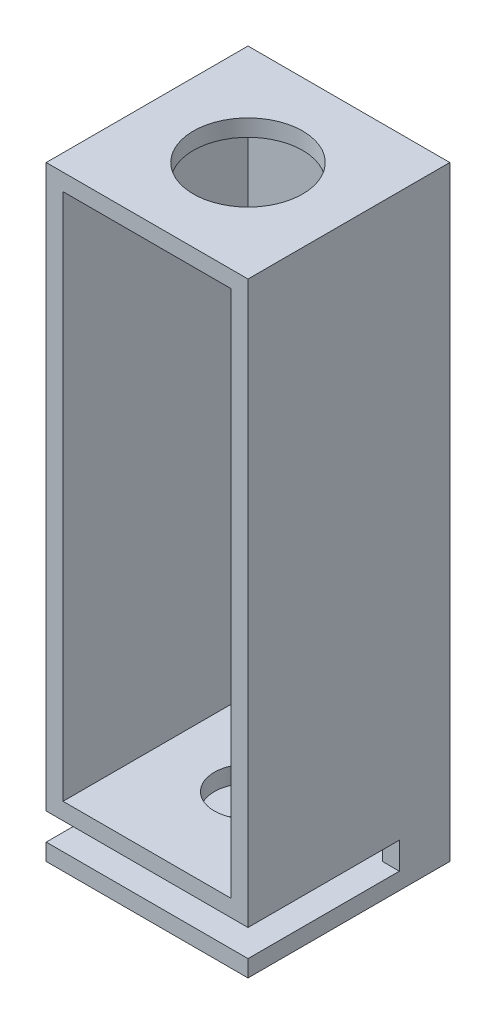
ISO-10303-21;
HEADER;
FILE_DESCRIPTION(('STEP AP214'),'2;1');
FILE_NAME('part.step','',(''),(''),'','','');
FILE_SCHEMA(('AUTOMOTIVE_DESIGN { 1 0 10303 214 1 1 1 1 }'));
ENDSEC;
DATA;
#1=APPLICATION_CONTEXT('core data for automotive mechanical design processes');
#2=APPLICATION_PROTOCOL_DEFINITION('international standard','automotive_design',2000,#1);
#3=PRODUCT_CONTEXT('',#1,'mechanical');
#4=PRODUCT('Part','Part','',(#3));
#5=PRODUCT_RELATED_PRODUCT_CATEGORY('part','',(#4));
#6=PRODUCT_DEFINITION_FORMATION('','',#4);
#7=PRODUCT_DEFINITION_CONTEXT('part definition',#1,'design');
#8=PRODUCT_DEFINITION('design','',#6,#7);
#9=PRODUCT_DEFINITION_SHAPE('','',#8);
#10=(LENGTH_UNIT() NAMED_UNIT(*) SI_UNIT(.MILLI.,.METRE.));
#11=(NAMED_UNIT(*) PLANE_ANGLE_UNIT() SI_UNIT($,.RADIAN.));
#12=(NAMED_UNIT(*) SI_UNIT($,.STERADIAN.) SOLID_ANGLE_UNIT());
#13=UNCERTAINTY_MEASURE_WITH_UNIT(LENGTH_MEASURE(1.E-05),#10,'distance_accuracy_value','');
#14=(GEOMETRIC_REPRESENTATION_CONTEXT(3) GLOBAL_UNCERTAINTY_ASSIGNED_CONTEXT((#13)) GLOBAL_UNIT_ASSIGNED_CONTEXT((#10,
#11,#12)) REPRESENTATION_CONTEXT('',''));
#15=CARTESIAN_POINT('',(0.,0.,0.));
#16=DIRECTION('',(0.,0.,1.));
#17=DIRECTION('',(1.,0.,0.));
#18=AXIS2_PLACEMENT_3D('',#15,#16,#17);
#19=CARTESIAN_POINT('',(5.,36.,-6.));
#20=DIRECTION('',(-1.,0.,0.));
#21=DIRECTION('',(0.,0.,1.));
#22=AXIS2_PLACEMENT_3D('',#19,#20,#21);
#23=PLANE('',#22);
#24=DIRECTION('',(0.,0.,1.));
#25=VECTOR('',#24,1.);
#26=CARTESIAN_POINT('',(5.,3.6,-15.0498756211209));
#27=LINE('',#26,#25);
#28=CARTESIAN_POINT('',(5.,3.6,-5.));
#29=VERTEX_POINT('',#28);
#30=CARTESIAN_POINT('',(5.,3.6,6.));
#31=VERTEX_POINT('',#30);
#32=EDGE_CURVE('E158',#29,#31,#27,.T.);
#33=ORIENTED_EDGE('',*,*,#32,.T.);
#34=DIRECTION('',(0.,-1.,0.));
#35=VECTOR('',#34,1.);
#36=CARTESIAN_POINT('',(5.,36.,6.));
#37=LINE('',#36,#35);
#38=CARTESIAN_POINT('',(5.,35.,6.));
#39=VERTEX_POINT('',#38);
#40=EDGE_CURVE('E173',#39,#31,#37,.T.);
#41=ORIENTED_EDGE('',*,*,#40,.F.);
#42=DIRECTION('',(0.,0.,-1.));
#43=VECTOR('',#42,1.);
#44=CARTESIAN_POINT('',(5.,35.,-6.));
#45=LINE('',#44,#43);
#46=CARTESIAN_POINT('',(5.,35.,-5.));
#47=VERTEX_POINT('',#46);
#48=EDGE_CURVE('E198',#39,#47,#45,.T.);
#49=ORIENTED_EDGE('',*,*,#48,.T.);
#50=DIRECTION('',(0.,-1.,0.));
#51=VECTOR('',#50,1.);
#52=CARTESIAN_POINT('',(5.,36.,-5.));
#53=LINE('',#52,#51);
#54=EDGE_CURVE('E176',#47,#29,#53,.T.);
#55=ORIENTED_EDGE('',*,*,#54,.T.);
#56=EDGE_LOOP('',(#33,#41,#49,#55));
#57=FACE_BOUND('',#56,.T.);
#58=ADVANCED_FACE('F38',(#57),#23,.T.);
#59=CARTESIAN_POINT('',(-6.,36.,-5.));
#60=DIRECTION('',(0.,0.,1.));
#61=DIRECTION('',(1.,0.,0.));
#62=AXIS2_PLACEMENT_3D('',#59,#60,#61);
#63=PLANE('',#62);
#64=DIRECTION('',(1.,0.,0.));
#65=VECTOR('',#64,1.);
#66=CARTESIAN_POINT('',(-5.,3.6,-5.));
#67=LINE('',#66,#65);
#68=CARTESIAN_POINT('',(-5.,3.6,-5.));
#69=VERTEX_POINT('',#68);
#70=EDGE_CURVE('E335',#69,#29,#67,.T.);
#71=ORIENTED_EDGE('',*,*,#70,.T.);
#72=ORIENTED_EDGE('',*,*,#54,.F.);
#73=DIRECTION('',(-1.,0.,0.));
#74=VECTOR('',#73,1.);
#75=CARTESIAN_POINT('',(-6.,35.,-5.));
#76=LINE('',#75,#74);
#77=CARTESIAN_POINT('',(-5.,35.,-5.));
#78=VERTEX_POINT('',#77);
#79=EDGE_CURVE('E272',#47,#78,#76,.T.);
#80=ORIENTED_EDGE('',*,*,#79,.T.);
#81=DIRECTION('',(0.,-1.,0.));
#82=VECTOR('',#81,1.);
#83=CARTESIAN_POINT('',(-5.,36.,-5.));
#84=LINE('',#83,#82);
#85=EDGE_CURVE('E276',#78,#69,#84,.T.);
#86=ORIENTED_EDGE('',*,*,#85,.T.);
#87=EDGE_LOOP('',(#71,#72,#80,#86));
#88=FACE_BOUND('',#87,.T.);
#89=ADVANCED_FACE('F409',(#88),#63,.T.);
#90=CARTESIAN_POINT('',(-5.,36.,-6.));
#91=DIRECTION('',(1.,0.,0.));
#92=DIRECTION('',(0.,0.,-1.));
#93=AXIS2_PLACEMENT_3D('',#90,#91,#92);
#94=PLANE('',#93);
#95=DIRECTION('',(0.,0.,1.));
#96=VECTOR('',#95,1.);
#97=CARTESIAN_POINT('',(-5.,3.6,-15.0498756211209));
#98=LINE('',#97,#96);
#99=CARTESIAN_POINT('',(-5.,3.6,6.));
#100=VERTEX_POINT('',#99);
#101=EDGE_CURVE('E161',#69,#100,#98,.T.);
#102=ORIENTED_EDGE('',*,*,#101,.F.);
#103=ORIENTED_EDGE('',*,*,#85,.F.);
#104=DIRECTION('',(0.,0.,1.));
#105=VECTOR('',#104,1.);
#106=CARTESIAN_POINT('',(-5.,35.,-6.));
#107=LINE('',#106,#105);
#108=CARTESIAN_POINT('',(-5.,35.,6.));
#109=VERTEX_POINT('',#108);
#110=EDGE_CURVE('E190',#78,#109,#107,.T.);
#111=ORIENTED_EDGE('',*,*,#110,.T.);
#112=DIRECTION('',(0.,-1.,0.));
#113=VECTOR('',#112,1.);
#114=CARTESIAN_POINT('',(-5.,36.,6.));
#115=LINE('',#114,#113);
#116=EDGE_CURVE('E184',#109,#100,#115,.T.);
#117=ORIENTED_EDGE('',*,*,#116,.T.);
#118=EDGE_LOOP('',(#102,#103,#111,#117));
#119=FACE_BOUND('',#118,.T.);
#120=ADVANCED_FACE('F414',(#119),#94,.T.);
#121=CARTESIAN_POINT('',(-6.,36.,6.));
#122=DIRECTION('',(0.,0.,-1.));
#123=DIRECTION('',(-1.,0.,0.));
#124=AXIS2_PLACEMENT_3D('',#121,#122,#123);
#125=PLANE('',#124);
#126=ORIENTED_EDGE('',*,*,#40,.T.);
#127=DIRECTION('',(-1.,0.,0.));
#128=VECTOR('',#127,1.);
#129=CARTESIAN_POINT('',(-5.,3.6,6.));
#130=LINE('',#129,#128);
#131=EDGE_CURVE('E155',#31,#100,#130,.T.);
#132=ORIENTED_EDGE('',*,*,#131,.T.);
#133=ORIENTED_EDGE('',*,*,#116,.F.);
#134=DIRECTION('',(1.,0.,0.));
#135=VECTOR('',#134,1.);
#136=CARTESIAN_POINT('',(-6.,35.,6.));
#137=LINE('',#136,#135);
#138=EDGE_CURVE('E182',#109,#39,#137,.T.);
#139=ORIENTED_EDGE('',*,*,#138,.T.);
#140=EDGE_LOOP('',(#126,#132,#133,#139));
#141=FACE_BOUND('',#140,.T.);
#142=DIRECTION('',(0.,-1.,0.));
#143=VECTOR('',#142,1.);
#144=CARTESIAN_POINT('',(-6.,36.,6.));
#145=LINE('',#144,#143);
#146=CARTESIAN_POINT('',(-6.,36.,6.));
#147=VERTEX_POINT('',#146);
#148=CARTESIAN_POINT('',(-6.,2.6,6.));
#149=VERTEX_POINT('',#148);
#150=EDGE_CURVE('E234',#147,#149,#145,.T.);
#151=ORIENTED_EDGE('',*,*,#150,.T.);
#152=DIRECTION('',(-1.,0.,0.));
#153=VECTOR('',#152,1.);
#154=CARTESIAN_POINT('',(-6.77267637178051,2.6,6.));
#155=LINE('',#154,#153);
#156=CARTESIAN_POINT('',(5.99999999999999,2.6,6.));
#157=VERTEX_POINT('',#156);
#158=EDGE_CURVE('E306',#157,#149,#155,.T.);
#159=ORIENTED_EDGE('',*,*,#158,.F.);
#160=DIRECTION('',(0.,-1.,0.));
#161=VECTOR('',#160,1.);
#162=CARTESIAN_POINT('',(6.,36.,6.));
#163=LINE('',#162,#161);
#164=CARTESIAN_POINT('',(6.,36.,6.));
#165=VERTEX_POINT('',#164);
#166=EDGE_CURVE('E229',#165,#157,#163,.T.);
#167=ORIENTED_EDGE('',*,*,#166,.F.);
#168=DIRECTION('',(1.,0.,0.));
#169=VECTOR('',#168,1.);
#170=CARTESIAN_POINT('',(-6.,36.,6.));
#171=LINE('',#170,#169);
#172=EDGE_CURVE('E211',#147,#165,#171,.T.);
#173=ORIENTED_EDGE('',*,*,#172,.F.);
#174=EDGE_LOOP('',(#151,#159,#167,#173));
#175=FACE_BOUND('',#174,.T.);
#176=ADVANCED_FACE('F180',(#141,#175),#125,.F.);
#177=CARTESIAN_POINT('',(5.99999999999999,1.,6.));
#178=VERTEX_POINT('',#177);
#179=CARTESIAN_POINT('',(6.,0.,6.));
#180=VERTEX_POINT('',#179);
#181=EDGE_CURVE('E214',#178,#180,#163,.T.);
#182=ORIENTED_EDGE('',*,*,#181,.F.);
#183=DIRECTION('',(1.,0.,0.));
#184=VECTOR('',#183,1.);
#185=CARTESIAN_POINT('',(-6.,1.,6.));
#186=LINE('',#185,#184);
#187=CARTESIAN_POINT('',(-6.,1.,6.));
#188=VERTEX_POINT('',#187);
#189=EDGE_CURVE('E195',#188,#178,#186,.T.);
#190=ORIENTED_EDGE('',*,*,#189,.F.);
#191=CARTESIAN_POINT('',(-6.,0.,6.));
#192=VERTEX_POINT('',#191);
#193=EDGE_CURVE('E233',#188,#192,#145,.T.);
#194=ORIENTED_EDGE('',*,*,#193,.T.);
#195=DIRECTION('',(1.,0.,0.));
#196=VECTOR('',#195,1.);
#197=CARTESIAN_POINT('',(-6.,0.,6.));
#198=LINE('',#197,#196);
#199=EDGE_CURVE('E205',#192,#180,#198,.T.);
#200=ORIENTED_EDGE('',*,*,#199,.T.);
#201=EDGE_LOOP('',(#182,#190,#194,#200));
#202=FACE_BOUND('',#201,.T.);
#203=ADVANCED_FACE('F322',(#202),#125,.F.);
#204=CARTESIAN_POINT('',(6.,36.,-6.));
#205=DIRECTION('',(-1.,0.,0.));
#206=DIRECTION('',(0.,0.,1.));
#207=AXIS2_PLACEMENT_3D('',#204,#205,#206);
#208=PLANE('',#207);
#209=ORIENTED_EDGE('',*,*,#166,.T.);
#210=DIRECTION('',(0.,0.,-1.));
#211=VECTOR('',#210,1.);
#212=CARTESIAN_POINT('',(6.,2.6,-6.));
#213=LINE('',#212,#211);
#214=CARTESIAN_POINT('',(5.99999999999999,2.6,-3.));
#215=VERTEX_POINT('',#214);
#216=EDGE_CURVE('E244',#157,#215,#213,.T.);
#217=ORIENTED_EDGE('',*,*,#216,.T.);
#218=DIRECTION('',(0.,-1.,0.));
#219=VECTOR('',#218,1.);
#220=CARTESIAN_POINT('',(6.,36.,-3.));
#221=LINE('',#220,#219);
#222=CARTESIAN_POINT('',(5.99999999999999,1.,-3.));
#223=VERTEX_POINT('',#222);
#224=EDGE_CURVE('E311',#215,#223,#221,.T.);
#225=ORIENTED_EDGE('',*,*,#224,.T.);
#226=DIRECTION('',(0.,0.,1.));
#227=VECTOR('',#226,1.);
#228=CARTESIAN_POINT('',(6.,1.,-6.));
#229=LINE('',#228,#227);
#230=EDGE_CURVE('E259',#223,#178,#229,.T.);
#231=ORIENTED_EDGE('',*,*,#230,.T.);
#232=ORIENTED_EDGE('',*,*,#181,.T.);
#233=DIRECTION('',(0.,0.,-1.));
#234=VECTOR('',#233,1.);
#235=CARTESIAN_POINT('',(6.,0.,-6.));
#236=LINE('',#235,#234);
#237=CARTESIAN_POINT('',(6.,0.,-6.));
#238=VERTEX_POINT('',#237);
#239=EDGE_CURVE('E215',#180,#238,#236,.T.);
#240=ORIENTED_EDGE('',*,*,#239,.T.);
#241=DIRECTION('',(0.,-1.,0.));
#242=VECTOR('',#241,1.);
#243=CARTESIAN_POINT('',(6.,36.,-6.));
#244=LINE('',#243,#242);
#245=CARTESIAN_POINT('',(6.,36.,-6.));
#246=VERTEX_POINT('',#245);
#247=EDGE_CURVE('E11',#246,#238,#244,.T.);
#248=ORIENTED_EDGE('',*,*,#247,.F.);
#249=DIRECTION('',(0.,0.,-1.));
#250=VECTOR('',#249,1.);
#251=CARTESIAN_POINT('',(6.,36.,-6.));
#252=LINE('',#251,#250);
#253=EDGE_CURVE('E200',#165,#246,#252,.T.);
#254=ORIENTED_EDGE('',*,*,#253,.F.);
#255=EDGE_LOOP('',(#209,#217,#225,#231,#232,#240,#248,#254));
#256=FACE_BOUND('',#255,.T.);
#257=ADVANCED_FACE('F40',(#256),#208,.F.);
#258=CARTESIAN_POINT('',(-6.,36.,-6.));
#259=DIRECTION('',(0.,0.,1.));
#260=DIRECTION('',(1.,0.,0.));
#261=AXIS2_PLACEMENT_3D('',#258,#259,#260);
#262=PLANE('',#261);
#263=DIRECTION('',(-1.,0.,0.));
#264=VECTOR('',#263,1.);
#265=CARTESIAN_POINT('',(-6.,0.,-6.));
#266=LINE('',#265,#264);
#267=CARTESIAN_POINT('',(-6.,0.,-6.));
#268=VERTEX_POINT('',#267);
#269=EDGE_CURVE('E219',#238,#268,#266,.T.);
#270=ORIENTED_EDGE('',*,*,#269,.T.);
#271=DIRECTION('',(0.,-1.,0.));
#272=VECTOR('',#271,1.);
#273=CARTESIAN_POINT('',(-6.,36.,-6.));
#274=LINE('',#273,#272);
#275=CARTESIAN_POINT('',(-6.,36.,-6.));
#276=VERTEX_POINT('',#275);
#277=EDGE_CURVE('E48',#276,#268,#274,.T.);
#278=ORIENTED_EDGE('',*,*,#277,.F.);
#279=DIRECTION('',(-1.,0.,0.));
#280=VECTOR('',#279,1.);
#281=CARTESIAN_POINT('',(-6.,36.,-6.));
#282=LINE('',#281,#280);
#283=EDGE_CURVE('E204',#246,#276,#282,.T.);
#284=ORIENTED_EDGE('',*,*,#283,.F.);
#285=ORIENTED_EDGE('',*,*,#247,.T.);
#286=EDGE_LOOP('',(#270,#278,#284,#285));
#287=FACE_BOUND('',#286,.T.);
#288=ADVANCED_FACE('F360',(#287),#262,.F.);
#289=CARTESIAN_POINT('',(-6.,36.,-6.));
#290=DIRECTION('',(1.,0.,0.));
#291=DIRECTION('',(0.,0.,-1.));
#292=AXIS2_PLACEMENT_3D('',#289,#290,#291);
#293=PLANE('',#292);
#294=DIRECTION('',(0.,1.,0.));
#295=VECTOR('',#294,1.);
#296=CARTESIAN_POINT('',(-6.,36.,-3.));
#297=LINE('',#296,#295);
#298=CARTESIAN_POINT('',(-6.,1.,-3.));
#299=VERTEX_POINT('',#298);
#300=CARTESIAN_POINT('',(-6.,2.6,-3.));
#301=VERTEX_POINT('',#300);
#302=EDGE_CURVE('E301',#299,#301,#297,.T.);
#303=ORIENTED_EDGE('',*,*,#302,.T.);
#304=DIRECTION('',(0.,0.,1.));
#305=VECTOR('',#304,1.);
#306=CARTESIAN_POINT('',(-6.,2.6,-6.));
#307=LINE('',#306,#305);
#308=EDGE_CURVE('E253',#301,#149,#307,.T.);
#309=ORIENTED_EDGE('',*,*,#308,.T.);
#310=ORIENTED_EDGE('',*,*,#150,.F.);
#311=DIRECTION('',(0.,0.,1.));
#312=VECTOR('',#311,1.);
#313=CARTESIAN_POINT('',(-6.,36.,-6.));
#314=LINE('',#313,#312);
#315=EDGE_CURVE('E208',#276,#147,#314,.T.);
#316=ORIENTED_EDGE('',*,*,#315,.F.);
#317=ORIENTED_EDGE('',*,*,#277,.T.);
#318=DIRECTION('',(0.,0.,1.));
#319=VECTOR('',#318,1.);
#320=CARTESIAN_POINT('',(-6.,0.,-6.));
#321=LINE('',#320,#319);
#322=EDGE_CURVE('E222',#268,#192,#321,.T.);
#323=ORIENTED_EDGE('',*,*,#322,.T.);
#324=ORIENTED_EDGE('',*,*,#193,.F.);
#325=DIRECTION('',(0.,0.,-1.));
#326=VECTOR('',#325,1.);
#327=CARTESIAN_POINT('',(-6.,1.,-6.));
#328=LINE('',#327,#326);
#329=EDGE_CURVE('E314',#188,#299,#328,.T.);
#330=ORIENTED_EDGE('',*,*,#329,.T.);
#331=EDGE_LOOP('',(#303,#309,#310,#316,#317,#323,#324,#330));
#332=FACE_BOUND('',#331,.T.);
#333=ADVANCED_FACE('F349',(#332),#293,.F.);
#334=CARTESIAN_POINT('',(0.,36.,0.));
#335=DIRECTION('',(0.,1.,0.));
#336=DIRECTION('',(0.,0.,1.));
#337=AXIS2_PLACEMENT_3D('',#334,#335,#336);
#338=PLANE('',#337);
#339=CARTESIAN_POINT('',(0.,36.,0.));
#340=DIRECTION('',(0.,1.,0.));
#341=DIRECTION('',(0.,0.,1.));
#342=AXIS2_PLACEMENT_3D('',#339,#340,#341);
#343=CIRCLE('',#342,3.25);
#344=CARTESIAN_POINT('',(0.,36.,-3.25));
#345=VERTEX_POINT('',#344);
#346=EDGE_CURVE('E243',#345,#345,#343,.F.);
#347=ORIENTED_EDGE('',*,*,#346,.T.);
#348=EDGE_LOOP('',(#347));
#349=FACE_BOUND('',#348,.T.);
#350=ORIENTED_EDGE('',*,*,#253,.T.);
#351=ORIENTED_EDGE('',*,*,#283,.T.);
#352=ORIENTED_EDGE('',*,*,#315,.T.);
#353=ORIENTED_EDGE('',*,*,#172,.T.);
#354=EDGE_LOOP('',(#350,#351,#352,#353));
#355=FACE_BOUND('',#354,.T.);
#356=ADVANCED_FACE('F362',(#349,#355),#338,.T.);
#357=CARTESIAN_POINT('',(0.,0.,0.));
#358=DIRECTION('',(0.,1.,0.));
#359=DIRECTION('',(0.,0.,1.));
#360=AXIS2_PLACEMENT_3D('',#357,#358,#359);
#361=PLANE('',#360);
#362=CARTESIAN_POINT('',(0.,0.,0.));
#363=DIRECTION('',(0.,1.,0.));
#364=DIRECTION('',(0.,0.,1.));
#365=AXIS2_PLACEMENT_3D('',#362,#363,#364);
#366=CIRCLE('',#365,2.);
#367=CARTESIAN_POINT('',(0.,0.,2.));
#368=VERTEX_POINT('',#367);
#369=EDGE_CURVE('E385',#368,#368,#366,.T.);
#370=ORIENTED_EDGE('',*,*,#369,.T.);
#371=EDGE_LOOP('',(#370));
#372=FACE_BOUND('',#371,.T.);
#373=ORIENTED_EDGE('',*,*,#239,.F.);
#374=ORIENTED_EDGE('',*,*,#199,.F.);
#375=ORIENTED_EDGE('',*,*,#322,.F.);
#376=ORIENTED_EDGE('',*,*,#269,.F.);
#377=EDGE_LOOP('',(#373,#374,#375,#376));
#378=FACE_BOUND('',#377,.T.);
#379=ADVANCED_FACE('F356',(#372,#378),#361,.F.);
#380=DIRECTION('',(0.,0.,1.));
#381=VECTOR('',#380,1.);
#382=CARTESIAN_POINT('',(5.,2.6,-15.0498756211209));
#383=LINE('',#382,#381);
#384=CARTESIAN_POINT('',(5.,2.6,-5.));
#385=VERTEX_POINT('',#384);
#386=CARTESIAN_POINT('',(5.,2.6,-3.));
#387=VERTEX_POINT('',#386);
#388=EDGE_CURVE('E56',#385,#387,#383,.T.);
#389=ORIENTED_EDGE('',*,*,#388,.F.);
#390=CARTESIAN_POINT('',(5.,1.,-5.));
#391=VERTEX_POINT('',#390);
#392=EDGE_CURVE('E269',#385,#391,#53,.T.);
#393=ORIENTED_EDGE('',*,*,#392,.T.);
#394=DIRECTION('',(0.,0.,-1.));
#395=VECTOR('',#394,1.);
#396=CARTESIAN_POINT('',(5.,1.,-6.));
#397=LINE('',#396,#395);
#398=CARTESIAN_POINT('',(5.,1.,-3.));
#399=VERTEX_POINT('',#398);
#400=EDGE_CURVE('E250',#399,#391,#397,.T.);
#401=ORIENTED_EDGE('',*,*,#400,.F.);
#402=DIRECTION('',(0.,-1.,0.));
#403=VECTOR('',#402,1.);
#404=CARTESIAN_POINT('',(5.,36.,-3.));
#405=LINE('',#404,#403);
#406=EDGE_CURVE('E296',#387,#399,#405,.T.);
#407=ORIENTED_EDGE('',*,*,#406,.F.);
#408=EDGE_LOOP('',(#389,#393,#401,#407));
#409=FACE_BOUND('',#408,.T.);
#410=ADVANCED_FACE('F372',(#409),#23,.T.);
#411=DIRECTION('',(-1.,0.,0.));
#412=VECTOR('',#411,1.);
#413=CARTESIAN_POINT('',(-5.,2.6,-5.));
#414=LINE('',#413,#412);
#415=CARTESIAN_POINT('',(-5.,2.6,-5.));
#416=VERTEX_POINT('',#415);
#417=EDGE_CURVE('E333',#385,#416,#414,.T.);
#418=ORIENTED_EDGE('',*,*,#417,.T.);
#419=CARTESIAN_POINT('',(-5.,1.,-5.));
#420=VERTEX_POINT('',#419);
#421=EDGE_CURVE('E188',#416,#420,#84,.T.);
#422=ORIENTED_EDGE('',*,*,#421,.T.);
#423=DIRECTION('',(-1.,0.,0.));
#424=VECTOR('',#423,1.);
#425=CARTESIAN_POINT('',(-6.,1.,-5.));
#426=LINE('',#425,#424);
#427=EDGE_CURVE('E266',#391,#420,#426,.T.);
#428=ORIENTED_EDGE('',*,*,#427,.F.);
#429=ORIENTED_EDGE('',*,*,#392,.F.);
#430=EDGE_LOOP('',(#418,#422,#428,#429));
#431=FACE_BOUND('',#430,.T.);
#432=ADVANCED_FACE('F331',(#431),#63,.T.);
#433=DIRECTION('',(0.,0.,1.));
#434=VECTOR('',#433,1.);
#435=CARTESIAN_POINT('',(-5.,2.6,-15.0498756211209));
#436=LINE('',#435,#434);
#437=CARTESIAN_POINT('',(-5.,2.6,-3.));
#438=VERTEX_POINT('',#437);
#439=EDGE_CURVE('E167',#416,#438,#436,.T.);
#440=ORIENTED_EDGE('',*,*,#439,.T.);
#441=DIRECTION('',(0.,1.,0.));
#442=VECTOR('',#441,1.);
#443=CARTESIAN_POINT('',(-5.,36.,-3.));
#444=LINE('',#443,#442);
#445=CARTESIAN_POINT('',(-5.,1.,-3.));
#446=VERTEX_POINT('',#445);
#447=EDGE_CURVE('E292',#446,#438,#444,.T.);
#448=ORIENTED_EDGE('',*,*,#447,.F.);
#449=DIRECTION('',(0.,0.,1.));
#450=VECTOR('',#449,1.);
#451=CARTESIAN_POINT('',(-5.,1.,-6.));
#452=LINE('',#451,#450);
#453=EDGE_CURVE('E199',#420,#446,#452,.T.);
#454=ORIENTED_EDGE('',*,*,#453,.F.);
#455=ORIENTED_EDGE('',*,*,#421,.F.);
#456=EDGE_LOOP('',(#440,#448,#454,#455));
#457=FACE_BOUND('',#456,.T.);
#458=ADVANCED_FACE('F291',(#457),#94,.T.);
#459=CARTESIAN_POINT('',(0.,35.,0.));
#460=DIRECTION('',(0.,1.,0.));
#461=DIRECTION('',(0.,0.,1.));
#462=AXIS2_PLACEMENT_3D('',#459,#460,#461);
#463=PLANE('',#462);
#464=CARTESIAN_POINT('',(0.,35.,0.));
#465=DIRECTION('',(0.,1.,0.));
#466=DIRECTION('',(0.,0.,1.));
#467=AXIS2_PLACEMENT_3D('',#464,#465,#466);
#468=CIRCLE('',#467,3.25);
#469=CARTESIAN_POINT('',(0.,35.,-3.25));
#470=VERTEX_POINT('',#469);
#471=EDGE_CURVE('E240',#470,#470,#468,.F.);
#472=ORIENTED_EDGE('',*,*,#471,.F.);
#473=EDGE_LOOP('',(#472));
#474=FACE_BOUND('',#473,.T.);
#475=ORIENTED_EDGE('',*,*,#48,.F.);
#476=ORIENTED_EDGE('',*,*,#138,.F.);
#477=ORIENTED_EDGE('',*,*,#110,.F.);
#478=ORIENTED_EDGE('',*,*,#79,.F.);
#479=EDGE_LOOP('',(#475,#476,#477,#478));
#480=FACE_BOUND('',#479,.T.);
#481=ADVANCED_FACE('F507',(#474,#480),#463,.F.);
#482=CARTESIAN_POINT('',(0.,1.,0.));
#483=DIRECTION('',(0.,1.,0.));
#484=DIRECTION('',(0.,0.,1.));
#485=AXIS2_PLACEMENT_3D('',#482,#483,#484);
#486=PLANE('',#485);
#487=CARTESIAN_POINT('',(0.,1.,0.));
#488=DIRECTION('',(0.,1.,0.));
#489=DIRECTION('',(0.,0.,1.));
#490=AXIS2_PLACEMENT_3D('',#487,#488,#489);
#491=CIRCLE('',#490,2.);
#492=CARTESIAN_POINT('',(0.,1.,2.));
#493=VERTEX_POINT('',#492);
#494=EDGE_CURVE('E168',#493,#493,#491,.T.);
#495=ORIENTED_EDGE('',*,*,#494,.F.);
#496=EDGE_LOOP('',(#495));
#497=FACE_BOUND('',#496,.T.);
#498=ORIENTED_EDGE('',*,*,#453,.T.);
#499=DIRECTION('',(1.,0.,0.));
#500=VECTOR('',#499,1.);
#501=CARTESIAN_POINT('',(-6.77267637178051,1.,-3.));
#502=LINE('',#501,#500);
#503=EDGE_CURVE('E64',#299,#446,#502,.T.);
#504=ORIENTED_EDGE('',*,*,#503,.F.);
#505=ORIENTED_EDGE('',*,*,#329,.F.);
#506=ORIENTED_EDGE('',*,*,#189,.T.);
#507=ORIENTED_EDGE('',*,*,#230,.F.);
#508=EDGE_CURVE('E339',#399,#223,#502,.T.);
#509=ORIENTED_EDGE('',*,*,#508,.F.);
#510=ORIENTED_EDGE('',*,*,#400,.T.);
#511=ORIENTED_EDGE('',*,*,#427,.T.);
#512=EDGE_LOOP('',(#498,#504,#505,#506,#507,#509,#510,#511));
#513=FACE_BOUND('',#512,.T.);
#514=ADVANCED_FACE('F285',(#497,#513),#486,.T.);
#515=CARTESIAN_POINT('',(0.,36.000012,0.));
#516=DIRECTION('',(0.,-1.,0.));
#517=DIRECTION('',(0.,0.,-1.));
#518=AXIS2_PLACEMENT_3D('',#515,#516,#517);
#519=CYLINDRICAL_SURFACE('',#518,3.25);
#520=CARTESIAN_POINT('',(0.,36.,-3.25));
#521=CARTESIAN_POINT('',(0.,35.9895833333333,-3.25));
#522=CARTESIAN_POINT('',(0.,35.9791666666667,-3.25));
#523=CARTESIAN_POINT('',(0.,35.9583333333333,-3.25));
#524=CARTESIAN_POINT('',(0.,35.9479166666667,-3.25));
#525=CARTESIAN_POINT('',(0.,35.9270833333333,-3.25));
#526=CARTESIAN_POINT('',(0.,35.9166666666667,-3.25));
#527=CARTESIAN_POINT('',(0.,35.8958333333333,-3.25));
#528=CARTESIAN_POINT('',(0.,35.8854166666667,-3.25));
#529=CARTESIAN_POINT('',(0.,35.8645833333333,-3.25));
#530=CARTESIAN_POINT('',(0.,35.8541666666667,-3.25));
#531=CARTESIAN_POINT('',(0.,35.8333333333333,-3.25));
#532=CARTESIAN_POINT('',(0.,35.8229166666667,-3.25));
#533=CARTESIAN_POINT('',(0.,35.8020833333333,-3.25));
#534=CARTESIAN_POINT('',(0.,35.7916666666667,-3.25));
#535=CARTESIAN_POINT('',(0.,35.7708333333333,-3.25));
#536=CARTESIAN_POINT('',(0.,35.7604166666667,-3.25));
#537=CARTESIAN_POINT('',(0.,35.7395833333333,-3.25));
#538=CARTESIAN_POINT('',(0.,35.7291666666667,-3.25));
#539=CARTESIAN_POINT('',(0.,35.7083333333333,-3.25));
#540=CARTESIAN_POINT('',(0.,35.6979166666667,-3.25));
#541=CARTESIAN_POINT('',(0.,35.6770833333333,-3.25));
#542=CARTESIAN_POINT('',(0.,35.6666666666667,-3.25));
#543=CARTESIAN_POINT('',(0.,35.6458333333333,-3.25));
#544=CARTESIAN_POINT('',(0.,35.6354166666667,-3.25));
#545=CARTESIAN_POINT('',(0.,35.6145833333333,-3.25));
#546=CARTESIAN_POINT('',(0.,35.6041666666667,-3.25));
#547=CARTESIAN_POINT('',(0.,35.5833333333333,-3.25));
#548=CARTESIAN_POINT('',(0.,35.5729166666667,-3.25));
#549=CARTESIAN_POINT('',(0.,35.5520833333333,-3.25));
#550=CARTESIAN_POINT('',(0.,35.5416666666667,-3.25));
#551=CARTESIAN_POINT('',(0.,35.5208333333333,-3.25));
#552=CARTESIAN_POINT('',(0.,35.5104166666667,-3.25));
#553=CARTESIAN_POINT('',(0.,35.4895833333333,-3.25));
#554=CARTESIAN_POINT('',(0.,35.4791666666667,-3.25));
#555=CARTESIAN_POINT('',(0.,35.4583333333333,-3.25));
#556=CARTESIAN_POINT('',(0.,35.4479166666667,-3.25));
#557=CARTESIAN_POINT('',(0.,35.4270833333333,-3.25));
#558=CARTESIAN_POINT('',(0.,35.4166666666667,-3.25));
#559=CARTESIAN_POINT('',(0.,35.3958333333333,-3.25));
#560=CARTESIAN_POINT('',(0.,35.3854166666667,-3.25));
#561=CARTESIAN_POINT('',(0.,35.3645833333333,-3.25));
#562=CARTESIAN_POINT('',(0.,35.3541666666667,-3.25));
#563=CARTESIAN_POINT('',(0.,35.3333333333333,-3.25));
#564=CARTESIAN_POINT('',(0.,35.3229166666667,-3.25));
#565=CARTESIAN_POINT('',(0.,35.3020833333333,-3.25));
#566=CARTESIAN_POINT('',(0.,35.2916666666667,-3.25));
#567=CARTESIAN_POINT('',(0.,35.2708333333333,-3.25));
#568=CARTESIAN_POINT('',(0.,35.2604166666667,-3.25));
#569=CARTESIAN_POINT('',(0.,35.2395833333333,-3.25));
#570=CARTESIAN_POINT('',(0.,35.2291666666667,-3.25));
#571=CARTESIAN_POINT('',(0.,35.2083333333333,-3.25));
#572=CARTESIAN_POINT('',(0.,35.1979166666667,-3.25));
#573=CARTESIAN_POINT('',(0.,35.1770833333333,-3.25));
#574=CARTESIAN_POINT('',(0.,35.1666666666667,-3.25));
#575=CARTESIAN_POINT('',(0.,35.1458333333333,-3.25));
#576=CARTESIAN_POINT('',(0.,35.1354166666667,-3.25));
#577=CARTESIAN_POINT('',(0.,35.1145833333333,-3.25));
#578=CARTESIAN_POINT('',(0.,35.1041666666667,-3.25));
#579=CARTESIAN_POINT('',(0.,35.0833333333333,-3.25));
#580=CARTESIAN_POINT('',(0.,35.0729166666667,-3.25));
#581=CARTESIAN_POINT('',(0.,35.0520833333333,-3.25));
#582=CARTESIAN_POINT('',(0.,35.0416666666667,-3.25));
#583=CARTESIAN_POINT('',(0.,35.0208333333333,-3.25));
#584=CARTESIAN_POINT('',(0.,35.0104166666667,-3.25));
#585=CARTESIAN_POINT('',(0.,35.,-3.25));
#586=B_SPLINE_CURVE_WITH_KNOTS('',3,(#520,#521,#522,#523,#524,#525,#526,#527,#528,#529,#530,
#531,#532,#533,#534,#535,#536,#537,#538,#539,#540,#541,#542,#543,#544,#545,#546,#547,#548,#549,
#550,#551,#552,#553,#554,#555,#556,#557,#558,#559,#560,#561,#562,#563,#564,#565,#566,#567,#568,
#569,#570,#571,#572,#573,#574,#575,#576,#577,#578,#579,#580,#581,#582,#583,#584,#585),
.UNSPECIFIED.,.F.,.F.,(4,2,2,2,2,2,2,2,2,2,2,2,2,2,2,2,2,2,2,2,2,2,2,2,2,2,2,2,2,2,2,2,4),(0.,
0.0312500000000035,0.0625000000000001,0.0937500000000036,0.125,0.156250000000004,0.1875,
0.218750000000004,0.25,0.281250000000004,0.3125,0.343750000000004,0.375,0.406250000000004,
0.4375,0.468750000000004,0.5,0.531250000000004,0.5625,0.593750000000004,0.625000000000001,
0.656250000000004,0.687500000000001,0.718750000000004,0.750000000000001,0.781250000000004,
0.812500000000001,0.843750000000004,0.875000000000001,0.906250000000004,0.937500000000001,
0.968750000000004,1.),.UNSPECIFIED.);
#587=EDGE_CURVE('BSEAM521',#345,#470,#586,.T.);
#588=ORIENTED_EDGE('',*,*,#346,.F.);
#589=ORIENTED_EDGE('',*,*,#471,.T.);
#590=ORIENTED_EDGE('',*,*,#587,.T.);
#591=ORIENTED_EDGE('',*,*,#587,.F.);
#592=EDGE_LOOP('',(#588,#590,#589,#591));
#593=FACE_BOUND('',#592,.T.);
#594=ADVANCED_FACE('F521',(#593),#519,.F.);
#595=CARTESIAN_POINT('',(0.,0.,-3.));
#596=DIRECTION('',(0.,0.,-1.));
#597=DIRECTION('',(-1.,0.,0.));
#598=AXIS2_PLACEMENT_3D('',#595,#596,#597);
#599=PLANE('',#598);
#600=ORIENTED_EDGE('',*,*,#503,.T.);
#601=ORIENTED_EDGE('',*,*,#447,.T.);
#602=DIRECTION('',(-1.,0.,0.));
#603=VECTOR('',#602,1.);
#604=CARTESIAN_POINT('',(-6.77267637178051,2.6,-3.));
#605=LINE('',#604,#603);
#606=EDGE_CURVE('E303',#438,#301,#605,.T.);
#607=ORIENTED_EDGE('',*,*,#606,.T.);
#608=ORIENTED_EDGE('',*,*,#302,.F.);
#609=EDGE_LOOP('',(#600,#601,#607,#608));
#610=FACE_BOUND('',#609,.T.);
#611=ADVANCED_FACE('F347',(#610),#599,.F.);
#612=CARTESIAN_POINT('',(-6.77267637178051,2.6,-3.));
#613=DIRECTION('',(0.,1.,0.));
#614=DIRECTION('',(0.,0.,1.));
#615=AXIS2_PLACEMENT_3D('',#612,#613,#614);
#616=PLANE('',#615);
#617=CARTESIAN_POINT('',(0.,2.6,0.));
#618=DIRECTION('',(0.,1.,0.));
#619=DIRECTION('',(0.,0.,1.));
#620=AXIS2_PLACEMENT_3D('',#617,#618,#619);
#621=CIRCLE('',#620,2.);
#622=CARTESIAN_POINT('',(0.,2.6,2.));
#623=VERTEX_POINT('',#622);
#624=EDGE_CURVE('E381',#623,#623,#621,.T.);
#625=ORIENTED_EDGE('',*,*,#624,.T.);
#626=EDGE_LOOP('',(#625));
#627=FACE_BOUND('',#626,.T.);
#628=ORIENTED_EDGE('',*,*,#158,.T.);
#629=ORIENTED_EDGE('',*,*,#308,.F.);
#630=ORIENTED_EDGE('',*,*,#606,.F.);
#631=ORIENTED_EDGE('',*,*,#439,.F.);
#632=ORIENTED_EDGE('',*,*,#417,.F.);
#633=ORIENTED_EDGE('',*,*,#388,.T.);
#634=EDGE_CURVE('E297',#215,#387,#605,.T.);
#635=ORIENTED_EDGE('',*,*,#634,.F.);
#636=ORIENTED_EDGE('',*,*,#216,.F.);
#637=EDGE_LOOP('',(#628,#629,#630,#631,#632,#633,#635,#636));
#638=FACE_BOUND('',#637,.T.);
#639=ADVANCED_FACE('F366',(#627,#638),#616,.F.);
#640=ORIENTED_EDGE('',*,*,#634,.T.);
#641=ORIENTED_EDGE('',*,*,#406,.T.);
#642=ORIENTED_EDGE('',*,*,#508,.T.);
#643=ORIENTED_EDGE('',*,*,#224,.F.);
#644=EDGE_LOOP('',(#640,#641,#642,#643));
#645=FACE_BOUND('',#644,.T.);
#646=ADVANCED_FACE('F369',(#645),#599,.F.);
#647=CARTESIAN_POINT('',(-5.,3.6,-15.0498756211209));
#648=DIRECTION('',(0.,1.,0.));
#649=DIRECTION('',(0.,0.,1.));
#650=AXIS2_PLACEMENT_3D('',#647,#648,#649);
#651=PLANE('',#650);
#652=CARTESIAN_POINT('',(0.,3.6,0.));
#653=DIRECTION('',(0.,1.,0.));
#654=DIRECTION('',(0.,0.,1.));
#655=AXIS2_PLACEMENT_3D('',#652,#653,#654);
#656=CIRCLE('',#655,2.);
#657=CARTESIAN_POINT('',(0.,3.6,2.));
#658=VERTEX_POINT('',#657);
#659=EDGE_CURVE('E42',#658,#658,#656,.T.);
#660=ORIENTED_EDGE('',*,*,#659,.F.);
#661=EDGE_LOOP('',(#660));
#662=FACE_BOUND('',#661,.T.);
#663=ORIENTED_EDGE('',*,*,#70,.F.);
#664=ORIENTED_EDGE('',*,*,#101,.T.);
#665=ORIENTED_EDGE('',*,*,#131,.F.);
#666=ORIENTED_EDGE('',*,*,#32,.F.);
#667=EDGE_LOOP('',(#663,#664,#665,#666));
#668=FACE_BOUND('',#667,.T.);
#669=ADVANCED_FACE('F157',(#662,#668),#651,.T.);
#670=CARTESIAN_POINT('',(0.,0.,0.));
#671=DIRECTION('',(0.,1.,0.));
#672=DIRECTION('',(0.,0.,1.));
#673=AXIS2_PLACEMENT_3D('',#670,#671,#672);
#674=CYLINDRICAL_SURFACE('',#673,2.);
#675=ORIENTED_EDGE('',*,*,#659,.T.);
#676=EDGE_LOOP('',(#675));
#677=FACE_BOUND('',#676,.T.);
#678=ORIENTED_EDGE('',*,*,#624,.F.);
#679=EDGE_LOOP('',(#678));
#680=FACE_BOUND('',#679,.T.);
#681=ADVANCED_FACE('F394',(#677,#680),#674,.F.);
#682=ORIENTED_EDGE('',*,*,#494,.T.);
#683=EDGE_LOOP('',(#682));
#684=FACE_BOUND('',#683,.T.);
#685=ORIENTED_EDGE('',*,*,#369,.F.);
#686=EDGE_LOOP('',(#685));
#687=FACE_BOUND('',#686,.T.);
#688=ADVANCED_FACE('F404',(#684,#687),#674,.F.);
#689=CLOSED_SHELL('',(#58,#89,#120,#176,#203,#257,#288,#333,#356,#379,#410,#432,#458,#481,#514,
#594,#611,#639,#646,#669,#681,#688));
#690=MANIFOLD_SOLID_BREP('B2',#689);
#691=ADVANCED_BREP_SHAPE_REPRESENTATION('',(#18,#690),#14);
#692=SHAPE_DEFINITION_REPRESENTATION(#9,#691);
ENDSEC;
END-ISO-10303-21;
